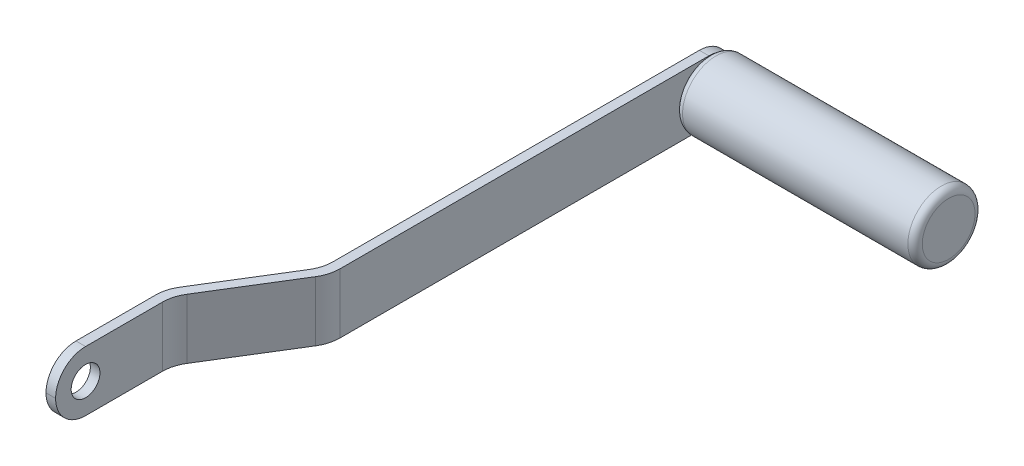
ISO-10303-21;
HEADER;
FILE_DESCRIPTION(('STEP AP214'),'2;1');
FILE_NAME('part.step','',(''),(''),'','','');
FILE_SCHEMA(('AUTOMOTIVE_DESIGN { 1 0 10303 214 1 1 1 1 }'));
ENDSEC;
DATA;
#1=APPLICATION_CONTEXT('core data for automotive mechanical design processes');
#2=APPLICATION_PROTOCOL_DEFINITION('international standard','automotive_design',2000,#1);
#3=PRODUCT_CONTEXT('',#1,'mechanical');
#4=PRODUCT('Part','Part','',(#3));
#5=PRODUCT_RELATED_PRODUCT_CATEGORY('part','',(#4));
#6=PRODUCT_DEFINITION_FORMATION('','',#4);
#7=PRODUCT_DEFINITION_CONTEXT('part definition',#1,'design');
#8=PRODUCT_DEFINITION('design','',#6,#7);
#9=PRODUCT_DEFINITION_SHAPE('','',#8);
#10=(LENGTH_UNIT() NAMED_UNIT(*) SI_UNIT(.MILLI.,.METRE.));
#11=(NAMED_UNIT(*) PLANE_ANGLE_UNIT() SI_UNIT($,.RADIAN.));
#12=(NAMED_UNIT(*) SI_UNIT($,.STERADIAN.) SOLID_ANGLE_UNIT());
#13=UNCERTAINTY_MEASURE_WITH_UNIT(LENGTH_MEASURE(1.E-05),#10,'distance_accuracy_value','');
#14=(GEOMETRIC_REPRESENTATION_CONTEXT(3) GLOBAL_UNCERTAINTY_ASSIGNED_CONTEXT((#13)) GLOBAL_UNIT_ASSIGNED_CONTEXT((#10,
#11,#12)) REPRESENTATION_CONTEXT('',''));
#15=CARTESIAN_POINT('',(0.,0.,0.));
#16=DIRECTION('',(0.,0.,1.));
#17=DIRECTION('',(1.,0.,0.));
#18=AXIS2_PLACEMENT_3D('',#15,#16,#17);
#19=CARTESIAN_POINT('',(129.,12.5,-247.5));
#20=DIRECTION('',(-1.,0.,0.));
#21=DIRECTION('',(0.,0.,1.));
#22=AXIS2_PLACEMENT_3D('',#19,#20,#21);
#23=CYLINDRICAL_SURFACE('',#22,14.);
#24=CARTESIAN_POINT('',(126.,12.5,-247.5));
#25=DIRECTION('',(1.,0.,0.));
#26=DIRECTION('',(0.,0.,-1.));
#27=AXIS2_PLACEMENT_3D('',#24,#25,#26);
#28=CIRCLE('',#27,14.);
#29=CARTESIAN_POINT('',(126.,12.5,-261.5));
#30=VERTEX_POINT('',#29);
#31=EDGE_CURVE('E48',#30,#30,#28,.F.);
#32=ORIENTED_EDGE('',*,*,#31,.T.);
#33=EDGE_LOOP('',(#32));
#34=FACE_BOUND('',#33,.T.);
#35=CARTESIAN_POINT('',(32.,12.5,-247.5));
#36=DIRECTION('',(1.,0.,0.));
#37=DIRECTION('',(0.,0.,-1.));
#38=AXIS2_PLACEMENT_3D('',#35,#36,#37);
#39=CIRCLE('',#38,14.);
#40=CARTESIAN_POINT('',(32.,12.5,-261.5));
#41=VERTEX_POINT('',#40);
#42=EDGE_CURVE('E52',#41,#41,#39,.T.);
#43=ORIENTED_EDGE('',*,*,#42,.T.);
#44=EDGE_LOOP('',(#43));
#45=FACE_BOUND('',#44,.T.);
#46=ADVANCED_FACE('F41',(#34,#45),#23,.T.);
#47=CARTESIAN_POINT('',(129.,12.5,-247.5));
#48=DIRECTION('',(1.,0.,0.));
#49=DIRECTION('',(0.,0.,-1.));
#50=AXIS2_PLACEMENT_3D('',#47,#48,#49);
#51=PLANE('',#50);
#52=CARTESIAN_POINT('',(129.,12.5,-247.5));
#53=DIRECTION('',(1.,0.,0.));
#54=DIRECTION('',(0.,0.,-1.));
#55=AXIS2_PLACEMENT_3D('',#52,#53,#54);
#56=CIRCLE('',#55,11.);
#57=CARTESIAN_POINT('',(129.,12.5,-258.5));
#58=VERTEX_POINT('',#57);
#59=EDGE_CURVE('E56',#58,#58,#56,.T.);
#60=ORIENTED_EDGE('',*,*,#59,.T.);
#61=EDGE_LOOP('',(#60));
#62=FACE_BOUND('',#61,.T.);
#63=ADVANCED_FACE('F62',(#62),#51,.T.);
#64=CARTESIAN_POINT('',(29.,12.5,-247.5));
#65=DIRECTION('',(1.,0.,0.));
#66=DIRECTION('',(0.,0.,-1.));
#67=AXIS2_PLACEMENT_3D('',#64,#65,#66);
#68=PLANE('',#67);
#69=CARTESIAN_POINT('',(29.,12.5,-247.5));
#70=DIRECTION('',(1.,0.,0.));
#71=DIRECTION('',(0.,0.,-1.));
#72=AXIS2_PLACEMENT_3D('',#69,#70,#71);
#73=CIRCLE('',#72,11.);
#74=CARTESIAN_POINT('',(29.,12.5,-258.5));
#75=VERTEX_POINT('',#74);
#76=EDGE_CURVE('E11',#75,#75,#73,.F.);
#77=ORIENTED_EDGE('',*,*,#76,.T.);
#78=EDGE_LOOP('',(#77));
#79=FACE_BOUND('',#78,.T.);
#80=ADVANCED_FACE('F66',(#79),#68,.F.);
#81=CARTESIAN_POINT('',(126.,12.5,-247.5));
#82=DIRECTION('',(1.,0.,0.));
#83=DIRECTION('',(0.,0.,-1.));
#84=AXIS2_PLACEMENT_3D('',#81,#82,#83);
#85=TOROIDAL_SURFACE('',#84,11.,3.);
#86=ORIENTED_EDGE('',*,*,#31,.F.);
#87=EDGE_LOOP('',(#86));
#88=FACE_BOUND('',#87,.T.);
#89=ORIENTED_EDGE('',*,*,#59,.F.);
#90=EDGE_LOOP('',(#89));
#91=FACE_BOUND('',#90,.T.);
#92=ADVANCED_FACE('F64',(#88,#91),#85,.T.);
#93=CARTESIAN_POINT('',(32.,12.5,-247.5));
#94=DIRECTION('',(1.,0.,0.));
#95=DIRECTION('',(0.,0.,-1.));
#96=AXIS2_PLACEMENT_3D('',#93,#94,#95);
#97=TOROIDAL_SURFACE('',#96,11.,3.);
#98=ORIENTED_EDGE('',*,*,#76,.F.);
#99=EDGE_LOOP('',(#98));
#100=FACE_BOUND('',#99,.T.);
#101=ORIENTED_EDGE('',*,*,#42,.F.);
#102=EDGE_LOOP('',(#101));
#103=FACE_BOUND('',#102,.T.);
#104=ADVANCED_FACE('F43',(#100,#103),#97,.T.);
#105=CLOSED_SHELL('',(#46,#63,#80,#92,#104));
#106=MANIFOLD_SOLID_BREP('B2',#105);
#107=CARTESIAN_POINT('',(29.,25.,-90.4991813264486));
#108=DIRECTION('',(-1.,0.,0.));
#109=DIRECTION('',(0.,0.,1.));
#110=AXIS2_PLACEMENT_3D('',#107,#108,#109);
#111=PLANE('',#110);
#112=DIRECTION('',(0.,0.,-1.));
#113=VECTOR('',#112,1.);
#114=CARTESIAN_POINT('',(29.,0.,-90.4991813264486));
#115=LINE('',#114,#113);
#116=CARTESIAN_POINT('',(29.,0.,-93.6208777470412));
#117=VERTEX_POINT('',#116);
#118=CARTESIAN_POINT('',(29.,0.,-247.5));
#119=VERTEX_POINT('',#118);
#120=EDGE_CURVE('E230',#117,#119,#115,.T.);
#121=ORIENTED_EDGE('',*,*,#120,.T.);
#122=CARTESIAN_POINT('',(29.,12.5,-247.5));
#123=DIRECTION('',(-1.,0.,0.));
#124=DIRECTION('',(0.,0.,1.));
#125=AXIS2_PLACEMENT_3D('',#122,#123,#124);
#126=CIRCLE('',#125,12.5);
#127=CARTESIAN_POINT('',(29.,12.5,-260.));
#128=VERTEX_POINT('',#127);
#129=EDGE_CURVE('E296',#119,#128,#126,.F.);
#130=ORIENTED_EDGE('',*,*,#129,.T.);
#131=CARTESIAN_POINT('',(29.,12.5,-247.5));
#132=DIRECTION('',(-1.,0.,0.));
#133=DIRECTION('',(0.,0.,1.));
#134=AXIS2_PLACEMENT_3D('',#131,#132,#133);
#135=CIRCLE('',#134,12.5);
#136=CARTESIAN_POINT('',(29.,25.,-247.5));
#137=VERTEX_POINT('',#136);
#138=EDGE_CURVE('E294',#128,#137,#135,.F.);
#139=ORIENTED_EDGE('',*,*,#138,.T.);
#140=DIRECTION('',(0.,0.,-1.));
#141=VECTOR('',#140,1.);
#142=CARTESIAN_POINT('',(29.,25.,-90.4991813264486));
#143=LINE('',#142,#141);
#144=CARTESIAN_POINT('',(29.,25.,-93.6208777470412));
#145=VERTEX_POINT('',#144);
#146=EDGE_CURVE('E232',#145,#137,#143,.T.);
#147=ORIENTED_EDGE('',*,*,#146,.F.);
#148=DIRECTION('',(0.,-1.,0.));
#149=VECTOR('',#148,1.);
#150=CARTESIAN_POINT('',(29.,25.,-93.6208777470412));
#151=LINE('',#150,#149);
#152=EDGE_CURVE('E218',#145,#117,#151,.T.);
#153=ORIENTED_EDGE('',*,*,#152,.T.);
#154=EDGE_LOOP('',(#121,#130,#139,#147,#153));
#155=FACE_BOUND('',#154,.T.);
#156=ADVANCED_FACE('F112',(#155),#111,.F.);
#157=CARTESIAN_POINT('',(25.,25.,-90.4991813264486));
#158=DIRECTION('',(-1.,0.,0.));
#159=DIRECTION('',(0.,0.,1.));
#160=AXIS2_PLACEMENT_3D('',#157,#158,#159);
#161=PLANE('',#160);
#162=CARTESIAN_POINT('',(25.,12.5,-247.5));
#163=DIRECTION('',(-1.,0.,0.));
#164=DIRECTION('',(0.,0.,1.));
#165=AXIS2_PLACEMENT_3D('',#162,#163,#164);
#166=CIRCLE('',#165,12.5);
#167=CARTESIAN_POINT('',(25.,25.,-247.5));
#168=VERTEX_POINT('',#167);
#169=CARTESIAN_POINT('',(25.,12.5,-260.));
#170=VERTEX_POINT('',#169);
#171=EDGE_CURVE('E298',#168,#170,#166,.T.);
#172=ORIENTED_EDGE('',*,*,#171,.T.);
#173=CARTESIAN_POINT('',(25.,12.5,-247.5));
#174=DIRECTION('',(-1.,0.,0.));
#175=DIRECTION('',(0.,0.,1.));
#176=AXIS2_PLACEMENT_3D('',#173,#174,#175);
#177=CIRCLE('',#176,12.5);
#178=CARTESIAN_POINT('',(25.,0.,-247.5));
#179=VERTEX_POINT('',#178);
#180=EDGE_CURVE('E300',#170,#179,#177,.T.);
#181=ORIENTED_EDGE('',*,*,#180,.T.);
#182=DIRECTION('',(0.,0.,-1.));
#183=VECTOR('',#182,1.);
#184=CARTESIAN_POINT('',(25.,0.,-90.4991813264486));
#185=LINE('',#184,#183);
#186=CARTESIAN_POINT('',(25.,0.,-94.7560400818022));
#187=VERTEX_POINT('',#186);
#188=EDGE_CURVE('E240',#187,#179,#185,.T.);
#189=ORIENTED_EDGE('',*,*,#188,.F.);
#190=DIRECTION('',(0.,-1.,0.));
#191=VECTOR('',#190,1.);
#192=CARTESIAN_POINT('',(25.,25.,-94.7560400818022));
#193=LINE('',#192,#191);
#194=CARTESIAN_POINT('',(25.,25.,-94.7560400818022));
#195=VERTEX_POINT('',#194);
#196=EDGE_CURVE('E273',#187,#195,#193,.F.);
#197=ORIENTED_EDGE('',*,*,#196,.T.);
#198=DIRECTION('',(0.,0.,-1.));
#199=VECTOR('',#198,1.);
#200=CARTESIAN_POINT('',(25.,25.,-90.4991813264486));
#201=LINE('',#200,#199);
#202=EDGE_CURVE('E322',#195,#168,#201,.T.);
#203=ORIENTED_EDGE('',*,*,#202,.T.);
#204=EDGE_LOOP('',(#172,#181,#189,#197,#203));
#205=FACE_BOUND('',#204,.T.);
#206=ADVANCED_FACE('F357',(#205),#161,.T.);
#207=CARTESIAN_POINT('',(0.,25.,-50.));
#208=DIRECTION('',(-0.850931364161853,0.,-0.525276892206052));
#209=DIRECTION('',(-0.525276892206052,0.,0.850931364161853));
#210=AXIS2_PLACEMENT_3D('',#207,#208,#209);
#211=PLANE('',#210);
#212=DIRECTION('',(0.525276892206052,0.,-0.850931364161853));
#213=VECTOR('',#212,1.);
#214=CARTESIAN_POINT('',(0.,25.,-50.));
#215=LINE('',#214,#213);
#216=CARTESIAN_POINT('',(2.23602953757221,25.,-53.6222946277373));
#217=VERTEX_POINT('',#216);
#218=CARTESIAN_POINT('',(22.7639704624278,25.,-86.8768866987114));
#219=VERTEX_POINT('',#218);
#220=EDGE_CURVE('E325',#217,#219,#215,.T.);
#221=ORIENTED_EDGE('',*,*,#220,.T.);
#222=DIRECTION('',(0.,-1.,0.));
#223=VECTOR('',#222,1.);
#224=CARTESIAN_POINT('',(22.7639704624278,0.,-86.8768866987114));
#225=LINE('',#224,#223);
#226=CARTESIAN_POINT('',(22.7639704624278,0.,-86.8768866987114));
#227=VERTEX_POINT('',#226);
#228=EDGE_CURVE('E270',#219,#227,#225,.T.);
#229=ORIENTED_EDGE('',*,*,#228,.T.);
#230=DIRECTION('',(0.525276892206052,0.,-0.850931364161853));
#231=VECTOR('',#230,1.);
#232=CARTESIAN_POINT('',(0.,0.,-50.));
#233=LINE('',#232,#231);
#234=CARTESIAN_POINT('',(2.23602953757221,0.,-53.6222946277373));
#235=VERTEX_POINT('',#234);
#236=EDGE_CURVE('E243',#235,#227,#233,.T.);
#237=ORIENTED_EDGE('',*,*,#236,.F.);
#238=DIRECTION('',(0.,-1.,0.));
#239=VECTOR('',#238,1.);
#240=CARTESIAN_POINT('',(2.23602953757221,25.,-53.6222946277373));
#241=LINE('',#240,#239);
#242=EDGE_CURVE('E268',#235,#217,#241,.F.);
#243=ORIENTED_EDGE('',*,*,#242,.T.);
#244=EDGE_LOOP('',(#221,#229,#237,#243));
#245=FACE_BOUND('',#244,.T.);
#246=ADVANCED_FACE('F353',(#245),#211,.T.);
#247=CARTESIAN_POINT('',(0.,25.,0.));
#248=DIRECTION('',(-1.,0.,0.));
#249=DIRECTION('',(0.,0.,1.));
#250=AXIS2_PLACEMENT_3D('',#247,#248,#249);
#251=PLANE('',#250);
#252=CARTESIAN_POINT('',(0.,12.5,-12.5));
#253=DIRECTION('',(-1.,0.,0.));
#254=DIRECTION('',(0.,0.,1.));
#255=AXIS2_PLACEMENT_3D('',#252,#253,#254);
#256=CIRCLE('',#255,6.);
#257=CARTESIAN_POINT('',(0.,12.5,-6.5));
#258=VERTEX_POINT('',#257);
#259=EDGE_CURVE('E313',#258,#258,#256,.T.);
#260=ORIENTED_EDGE('',*,*,#259,.F.);
#261=EDGE_LOOP('',(#260));
#262=FACE_BOUND('',#261,.T.);
#263=DIRECTION('',(0.,0.,-1.));
#264=VECTOR('',#263,1.);
#265=CARTESIAN_POINT('',(0.,0.,0.));
#266=LINE('',#265,#264);
#267=CARTESIAN_POINT('',(0.,0.,-12.5));
#268=VERTEX_POINT('',#267);
#269=CARTESIAN_POINT('',(0.,0.,-45.7431412446465));
#270=VERTEX_POINT('',#269);
#271=EDGE_CURVE('E253',#268,#270,#266,.T.);
#272=ORIENTED_EDGE('',*,*,#271,.F.);
#273=CARTESIAN_POINT('',(0.,12.5,-12.5));
#274=DIRECTION('',(-1.,0.,0.));
#275=DIRECTION('',(0.,0.,1.));
#276=AXIS2_PLACEMENT_3D('',#273,#274,#275);
#277=CIRCLE('',#276,12.5);
#278=CARTESIAN_POINT('',(0.,12.5,0.));
#279=VERTEX_POINT('',#278);
#280=EDGE_CURVE('E135',#268,#279,#277,.T.);
#281=ORIENTED_EDGE('',*,*,#280,.T.);
#282=CARTESIAN_POINT('',(0.,12.5,-12.5));
#283=DIRECTION('',(-1.,0.,0.));
#284=DIRECTION('',(0.,0.,1.));
#285=AXIS2_PLACEMENT_3D('',#282,#283,#284);
#286=CIRCLE('',#285,12.5);
#287=CARTESIAN_POINT('',(0.,25.,-12.5));
#288=VERTEX_POINT('',#287);
#289=EDGE_CURVE('E306',#279,#288,#286,.T.);
#290=ORIENTED_EDGE('',*,*,#289,.T.);
#291=DIRECTION('',(0.,0.,-1.));
#292=VECTOR('',#291,1.);
#293=CARTESIAN_POINT('',(0.,25.,0.));
#294=LINE('',#293,#292);
#295=CARTESIAN_POINT('',(0.,25.,-45.7431412446465));
#296=VERTEX_POINT('',#295);
#297=EDGE_CURVE('E328',#288,#296,#294,.T.);
#298=ORIENTED_EDGE('',*,*,#297,.T.);
#299=DIRECTION('',(0.,-1.,0.));
#300=VECTOR('',#299,1.);
#301=CARTESIAN_POINT('',(0.,25.,-45.7431412446465));
#302=LINE('',#301,#300);
#303=EDGE_CURVE('E275',#296,#270,#302,.T.);
#304=ORIENTED_EDGE('',*,*,#303,.T.);
#305=EDGE_LOOP('',(#272,#281,#290,#298,#304));
#306=FACE_BOUND('',#305,.T.);
#307=ADVANCED_FACE('F346',(#262,#306),#251,.T.);
#308=CARTESIAN_POINT('',(4.,25.,0.));
#309=DIRECTION('',(-1.,0.,0.));
#310=DIRECTION('',(0.,0.,1.));
#311=AXIS2_PLACEMENT_3D('',#308,#309,#310);
#312=PLANE('',#311);
#313=CARTESIAN_POINT('',(4.,12.5,-12.5));
#314=DIRECTION('',(-1.,0.,0.));
#315=DIRECTION('',(0.,0.,1.));
#316=AXIS2_PLACEMENT_3D('',#313,#314,#315);
#317=CIRCLE('',#316,6.);
#318=CARTESIAN_POINT('',(4.,12.5,-6.5));
#319=VERTEX_POINT('',#318);
#320=EDGE_CURVE('E116',#319,#319,#317,.T.);
#321=ORIENTED_EDGE('',*,*,#320,.T.);
#322=EDGE_LOOP('',(#321));
#323=FACE_BOUND('',#322,.T.);
#324=CARTESIAN_POINT('',(4.,12.5,-12.5));
#325=DIRECTION('',(-1.,0.,0.));
#326=DIRECTION('',(0.,0.,1.));
#327=AXIS2_PLACEMENT_3D('',#324,#325,#326);
#328=CIRCLE('',#327,12.5);
#329=CARTESIAN_POINT('',(4.,25.,-12.5));
#330=VERTEX_POINT('',#329);
#331=CARTESIAN_POINT('',(4.,12.5,0.));
#332=VERTEX_POINT('',#331);
#333=EDGE_CURVE('E121',#330,#332,#328,.F.);
#334=ORIENTED_EDGE('',*,*,#333,.T.);
#335=CARTESIAN_POINT('',(4.,12.5,-12.5));
#336=DIRECTION('',(-1.,0.,0.));
#337=DIRECTION('',(0.,0.,1.));
#338=AXIS2_PLACEMENT_3D('',#335,#336,#337);
#339=CIRCLE('',#338,12.5);
#340=CARTESIAN_POINT('',(4.,0.,-12.5));
#341=VERTEX_POINT('',#340);
#342=EDGE_CURVE('E39',#332,#341,#339,.F.);
#343=ORIENTED_EDGE('',*,*,#342,.T.);
#344=DIRECTION('',(0.,0.,-1.));
#345=VECTOR('',#344,1.);
#346=CARTESIAN_POINT('',(4.,0.,0.));
#347=LINE('',#346,#345);
#348=CARTESIAN_POINT('',(4.,0.,-44.6079789098856));
#349=VERTEX_POINT('',#348);
#350=EDGE_CURVE('E255',#341,#349,#347,.T.);
#351=ORIENTED_EDGE('',*,*,#350,.T.);
#352=DIRECTION('',(0.,-1.,0.));
#353=VECTOR('',#352,1.);
#354=CARTESIAN_POINT('',(4.,25.,-44.6079789098856));
#355=LINE('',#354,#353);
#356=CARTESIAN_POINT('',(4.,25.,-44.6079789098856));
#357=VERTEX_POINT('',#356);
#358=EDGE_CURVE('E278',#349,#357,#355,.F.);
#359=ORIENTED_EDGE('',*,*,#358,.T.);
#360=DIRECTION('',(0.,0.,-1.));
#361=VECTOR('',#360,1.);
#362=CARTESIAN_POINT('',(4.,25.,0.));
#363=LINE('',#362,#361);
#364=EDGE_CURVE('E329',#330,#357,#363,.T.);
#365=ORIENTED_EDGE('',*,*,#364,.F.);
#366=EDGE_LOOP('',(#334,#343,#351,#359,#365));
#367=FACE_BOUND('',#366,.T.);
#368=ADVANCED_FACE('F344',(#323,#367),#312,.F.);
#369=CARTESIAN_POINT('',(3.40372545664741,25.,-47.8988924311758));
#370=DIRECTION('',(-0.850931364161853,0.,-0.525276892206052));
#371=DIRECTION('',(-0.525276892206052,0.,0.850931364161853));
#372=AXIS2_PLACEMENT_3D('',#369,#370,#371);
#373=PLANE('',#372);
#374=DIRECTION('',(0.525276892206052,0.,-0.850931364161853));
#375=VECTOR('',#374,1.);
#376=CARTESIAN_POINT('',(3.40372545664741,0.,-47.8988924311758));
#377=LINE('',#376,#375);
#378=CARTESIAN_POINT('',(6.23602953757221,0.,-52.4871322929763));
#379=VERTEX_POINT('',#378);
#380=CARTESIAN_POINT('',(26.7639704624278,0.,-85.7417243639504));
#381=VERTEX_POINT('',#380);
#382=EDGE_CURVE('E257',#379,#381,#377,.T.);
#383=ORIENTED_EDGE('',*,*,#382,.T.);
#384=DIRECTION('',(0.,-1.,0.));
#385=VECTOR('',#384,1.);
#386=CARTESIAN_POINT('',(26.7639704624278,25.,-85.7417243639504));
#387=LINE('',#386,#385);
#388=CARTESIAN_POINT('',(26.7639704624278,25.,-85.7417243639504));
#389=VERTEX_POINT('',#388);
#390=EDGE_CURVE('E219',#381,#389,#387,.F.);
#391=ORIENTED_EDGE('',*,*,#390,.T.);
#392=DIRECTION('',(0.525276892206052,0.,-0.850931364161853));
#393=VECTOR('',#392,1.);
#394=CARTESIAN_POINT('',(3.40372545664741,25.,-47.8988924311758));
#395=LINE('',#394,#393);
#396=CARTESIAN_POINT('',(6.23602953757221,25.,-52.4871322929763));
#397=VERTEX_POINT('',#396);
#398=EDGE_CURVE('E233',#397,#389,#395,.T.);
#399=ORIENTED_EDGE('',*,*,#398,.F.);
#400=DIRECTION('',(0.,-1.,0.));
#401=VECTOR('',#400,1.);
#402=CARTESIAN_POINT('',(6.23602953757221,0.,-52.4871322929763));
#403=LINE('',#402,#401);
#404=EDGE_CURVE('E224',#397,#379,#403,.T.);
#405=ORIENTED_EDGE('',*,*,#404,.T.);
#406=EDGE_LOOP('',(#383,#391,#399,#405));
#407=FACE_BOUND('',#406,.T.);
#408=ADVANCED_FACE('F337',(#407),#373,.F.);
#409=CARTESIAN_POINT('',(0.,25.,0.));
#410=DIRECTION('',(0.,-1.,0.));
#411=DIRECTION('',(-1.,0.,0.));
#412=AXIS2_PLACEMENT_3D('',#409,#410,#411);
#413=PLANE('',#412);
#414=ORIENTED_EDGE('',*,*,#146,.T.);
#415=DIRECTION('',(1.,0.,0.));
#416=VECTOR('',#415,1.);
#417=CARTESIAN_POINT('',(25.,25.,-247.5));
#418=LINE('',#417,#416);
#419=EDGE_CURVE('E304',#137,#168,#418,.F.);
#420=ORIENTED_EDGE('',*,*,#419,.T.);
#421=ORIENTED_EDGE('',*,*,#202,.F.);
#422=CARTESIAN_POINT('',(10.,25.,-94.7560400818022));
#423=DIRECTION('',(0.,-1.,0.));
#424=DIRECTION('',(0.,0.,-1.));
#425=AXIS2_PLACEMENT_3D('',#422,#423,#424);
#426=CIRCLE('',#425,15.);
#427=EDGE_CURVE('E283',#195,#219,#426,.T.);
#428=ORIENTED_EDGE('',*,*,#427,.T.);
#429=ORIENTED_EDGE('',*,*,#220,.F.);
#430=CARTESIAN_POINT('',(15.,25.,-45.7431412446465));
#431=DIRECTION('',(0.,-1.,0.));
#432=DIRECTION('',(0.,0.,-1.));
#433=AXIS2_PLACEMENT_3D('',#430,#431,#432);
#434=CIRCLE('',#433,15.);
#435=EDGE_CURVE('E263',#217,#296,#434,.F.);
#436=ORIENTED_EDGE('',*,*,#435,.T.);
#437=ORIENTED_EDGE('',*,*,#297,.F.);
#438=DIRECTION('',(-1.,0.,0.));
#439=VECTOR('',#438,1.);
#440=CARTESIAN_POINT('',(4.,25.,-12.5));
#441=LINE('',#440,#439);
#442=EDGE_CURVE('E302',#288,#330,#441,.F.);
#443=ORIENTED_EDGE('',*,*,#442,.T.);
#444=ORIENTED_EDGE('',*,*,#364,.T.);
#445=CARTESIAN_POINT('',(19.,25.,-44.6079789098856));
#446=DIRECTION('',(0.,-1.,0.));
#447=DIRECTION('',(0.,0.,-1.));
#448=AXIS2_PLACEMENT_3D('',#445,#446,#447);
#449=CIRCLE('',#448,15.);
#450=EDGE_CURVE('E288',#357,#397,#449,.T.);
#451=ORIENTED_EDGE('',*,*,#450,.T.);
#452=ORIENTED_EDGE('',*,*,#398,.T.);
#453=CARTESIAN_POINT('',(14.,25.,-93.6208777470412));
#454=DIRECTION('',(0.,-1.,0.));
#455=DIRECTION('',(0.,0.,-1.));
#456=AXIS2_PLACEMENT_3D('',#453,#454,#455);
#457=CIRCLE('',#456,15.);
#458=EDGE_CURVE('E266',#389,#145,#457,.F.);
#459=ORIENTED_EDGE('',*,*,#458,.T.);
#460=EDGE_LOOP('',(#414,#420,#421,#428,#429,#436,#437,#443,#444,#451,#452,#459));
#461=FACE_BOUND('',#460,.T.);
#462=ADVANCED_FACE('F333',(#461),#413,.F.);
#463=CARTESIAN_POINT('',(0.,0.,0.));
#464=DIRECTION('',(0.,-1.,0.));
#465=DIRECTION('',(-1.,0.,0.));
#466=AXIS2_PLACEMENT_3D('',#463,#464,#465);
#467=PLANE('',#466);
#468=ORIENTED_EDGE('',*,*,#188,.T.);
#469=DIRECTION('',(1.,0.,0.));
#470=VECTOR('',#469,1.);
#471=CARTESIAN_POINT('',(0.,0.,-247.5));
#472=LINE('',#471,#470);
#473=EDGE_CURVE('E239',#179,#119,#472,.T.);
#474=ORIENTED_EDGE('',*,*,#473,.T.);
#475=ORIENTED_EDGE('',*,*,#120,.F.);
#476=CARTESIAN_POINT('',(14.,0.,-93.6208777470412));
#477=DIRECTION('',(0.,-1.,0.));
#478=DIRECTION('',(0.,0.,-1.));
#479=AXIS2_PLACEMENT_3D('',#476,#477,#478);
#480=CIRCLE('',#479,15.);
#481=EDGE_CURVE('E214',#117,#381,#480,.T.);
#482=ORIENTED_EDGE('',*,*,#481,.T.);
#483=ORIENTED_EDGE('',*,*,#382,.F.);
#484=CARTESIAN_POINT('',(19.,0.,-44.6079789098856));
#485=DIRECTION('',(0.,-1.,0.));
#486=DIRECTION('',(0.,0.,-1.));
#487=AXIS2_PLACEMENT_3D('',#484,#485,#486);
#488=CIRCLE('',#487,15.);
#489=EDGE_CURVE('E285',#379,#349,#488,.F.);
#490=ORIENTED_EDGE('',*,*,#489,.T.);
#491=ORIENTED_EDGE('',*,*,#350,.F.);
#492=DIRECTION('',(-1.,0.,0.));
#493=VECTOR('',#492,1.);
#494=CARTESIAN_POINT('',(0.,0.,-12.5));
#495=LINE('',#494,#493);
#496=EDGE_CURVE('E290',#341,#268,#495,.T.);
#497=ORIENTED_EDGE('',*,*,#496,.T.);
#498=ORIENTED_EDGE('',*,*,#271,.T.);
#499=CARTESIAN_POINT('',(15.,0.,-45.7431412446465));
#500=DIRECTION('',(0.,-1.,0.));
#501=DIRECTION('',(0.,0.,-1.));
#502=AXIS2_PLACEMENT_3D('',#499,#500,#501);
#503=CIRCLE('',#502,15.);
#504=EDGE_CURVE('E225',#270,#235,#503,.T.);
#505=ORIENTED_EDGE('',*,*,#504,.T.);
#506=ORIENTED_EDGE('',*,*,#236,.T.);
#507=CARTESIAN_POINT('',(10.,0.,-94.7560400818022));
#508=DIRECTION('',(0.,-1.,0.));
#509=DIRECTION('',(0.,0.,-1.));
#510=AXIS2_PLACEMENT_3D('',#507,#508,#509);
#511=CIRCLE('',#510,15.);
#512=EDGE_CURVE('E281',#227,#187,#511,.F.);
#513=ORIENTED_EDGE('',*,*,#512,.T.);
#514=EDGE_LOOP('',(#468,#474,#475,#482,#483,#490,#491,#497,#498,#505,#506,#513));
#515=FACE_BOUND('',#514,.T.);
#516=ADVANCED_FACE('F237',(#515),#467,.T.);
#517=CARTESIAN_POINT('',(14.,25.,-93.6208777470412));
#518=DIRECTION('',(0.,-1.,0.));
#519=DIRECTION('',(0.,0.,-1.));
#520=AXIS2_PLACEMENT_3D('',#517,#518,#519);
#521=CYLINDRICAL_SURFACE('',#520,15.);
#522=ORIENTED_EDGE('',*,*,#458,.F.);
#523=ORIENTED_EDGE('',*,*,#390,.F.);
#524=ORIENTED_EDGE('',*,*,#481,.F.);
#525=ORIENTED_EDGE('',*,*,#152,.F.);
#526=EDGE_LOOP('',(#522,#523,#524,#525));
#527=FACE_BOUND('',#526,.T.);
#528=ADVANCED_FACE('F217',(#527),#521,.T.);
#529=CARTESIAN_POINT('',(10.,25.,-94.7560400818022));
#530=DIRECTION('',(0.,1.,0.));
#531=DIRECTION('',(0.,0.,1.));
#532=AXIS2_PLACEMENT_3D('',#529,#530,#531);
#533=CYLINDRICAL_SURFACE('',#532,15.);
#534=ORIENTED_EDGE('',*,*,#427,.F.);
#535=ORIENTED_EDGE('',*,*,#196,.F.);
#536=ORIENTED_EDGE('',*,*,#512,.F.);
#537=ORIENTED_EDGE('',*,*,#228,.F.);
#538=EDGE_LOOP('',(#534,#535,#536,#537));
#539=FACE_BOUND('',#538,.T.);
#540=ADVANCED_FACE('F368',(#539),#533,.F.);
#541=CARTESIAN_POINT('',(15.,25.,-45.7431412446465));
#542=DIRECTION('',(0.,-1.,0.));
#543=DIRECTION('',(0.,0.,-1.));
#544=AXIS2_PLACEMENT_3D('',#541,#542,#543);
#545=CYLINDRICAL_SURFACE('',#544,15.);
#546=ORIENTED_EDGE('',*,*,#435,.F.);
#547=ORIENTED_EDGE('',*,*,#242,.F.);
#548=ORIENTED_EDGE('',*,*,#504,.F.);
#549=ORIENTED_EDGE('',*,*,#303,.F.);
#550=EDGE_LOOP('',(#546,#547,#548,#549));
#551=FACE_BOUND('',#550,.T.);
#552=ADVANCED_FACE('F371',(#551),#545,.T.);
#553=CARTESIAN_POINT('',(19.,25.,-44.6079789098856));
#554=DIRECTION('',(0.,1.,0.));
#555=DIRECTION('',(0.,0.,1.));
#556=AXIS2_PLACEMENT_3D('',#553,#554,#555);
#557=CYLINDRICAL_SURFACE('',#556,15.);
#558=ORIENTED_EDGE('',*,*,#450,.F.);
#559=ORIENTED_EDGE('',*,*,#358,.F.);
#560=ORIENTED_EDGE('',*,*,#489,.F.);
#561=ORIENTED_EDGE('',*,*,#404,.F.);
#562=EDGE_LOOP('',(#558,#559,#560,#561));
#563=FACE_BOUND('',#562,.T.);
#564=ADVANCED_FACE('F339',(#563),#557,.F.);
#565=CARTESIAN_POINT('',(25.,12.5,-247.5));
#566=DIRECTION('',(-1.,0.,0.));
#567=DIRECTION('',(0.,0.,1.));
#568=AXIS2_PLACEMENT_3D('',#565,#566,#567);
#569=CYLINDRICAL_SURFACE('',#568,12.5);
#570=DIRECTION('',(1.,0.,0.));
#571=VECTOR('',#570,1.);
#572=CARTESIAN_POINT('',(29.,12.5,-260.));
#573=LINE('',#572,#571);
#574=EDGE_CURVE('E241',#170,#128,#573,.T.);
#575=ORIENTED_EDGE('',*,*,#574,.F.);
#576=ORIENTED_EDGE('',*,*,#171,.F.);
#577=ORIENTED_EDGE('',*,*,#419,.F.);
#578=ORIENTED_EDGE('',*,*,#138,.F.);
#579=EDGE_LOOP('',(#575,#576,#577,#578));
#580=FACE_BOUND('',#579,.T.);
#581=ADVANCED_FACE('F378',(#580),#569,.T.);
#582=CARTESIAN_POINT('',(0.,12.5,-247.5));
#583=DIRECTION('',(1.,0.,0.));
#584=DIRECTION('',(0.,0.,-1.));
#585=AXIS2_PLACEMENT_3D('',#582,#583,#584);
#586=CYLINDRICAL_SURFACE('',#585,12.5);
#587=ORIENTED_EDGE('',*,*,#180,.F.);
#588=ORIENTED_EDGE('',*,*,#574,.T.);
#589=ORIENTED_EDGE('',*,*,#129,.F.);
#590=ORIENTED_EDGE('',*,*,#473,.F.);
#591=EDGE_LOOP('',(#587,#588,#589,#590));
#592=FACE_BOUND('',#591,.T.);
#593=ADVANCED_FACE('F379',(#592),#586,.T.);
#594=CARTESIAN_POINT('',(4.,12.5,-12.5));
#595=DIRECTION('',(1.,0.,0.));
#596=DIRECTION('',(0.,0.,-1.));
#597=AXIS2_PLACEMENT_3D('',#594,#595,#596);
#598=CYLINDRICAL_SURFACE('',#597,12.5);
#599=DIRECTION('',(-1.,0.,0.));
#600=VECTOR('',#599,1.);
#601=CARTESIAN_POINT('',(0.,12.5,0.));
#602=LINE('',#601,#600);
#603=EDGE_CURVE('E246',#332,#279,#602,.T.);
#604=ORIENTED_EDGE('',*,*,#603,.F.);
#605=ORIENTED_EDGE('',*,*,#333,.F.);
#606=ORIENTED_EDGE('',*,*,#442,.F.);
#607=ORIENTED_EDGE('',*,*,#289,.F.);
#608=EDGE_LOOP('',(#604,#605,#606,#607));
#609=FACE_BOUND('',#608,.T.);
#610=ADVANCED_FACE('F114',(#609),#598,.T.);
#611=CARTESIAN_POINT('',(0.,12.5,-12.5));
#612=DIRECTION('',(-1.,0.,0.));
#613=DIRECTION('',(0.,0.,1.));
#614=AXIS2_PLACEMENT_3D('',#611,#612,#613);
#615=CYLINDRICAL_SURFACE('',#614,12.5);
#616=ORIENTED_EDGE('',*,*,#342,.F.);
#617=ORIENTED_EDGE('',*,*,#603,.T.);
#618=ORIENTED_EDGE('',*,*,#280,.F.);
#619=ORIENTED_EDGE('',*,*,#496,.F.);
#620=EDGE_LOOP('',(#616,#617,#618,#619));
#621=FACE_BOUND('',#620,.T.);
#622=ADVANCED_FACE('F343',(#621),#615,.T.);
#623=CARTESIAN_POINT('',(10.,12.5,-12.5));
#624=DIRECTION('',(-1.,0.,0.));
#625=DIRECTION('',(0.,0.,1.));
#626=AXIS2_PLACEMENT_3D('',#623,#624,#625);
#627=CYLINDRICAL_SURFACE('',#626,6.);
#628=ORIENTED_EDGE('',*,*,#259,.T.);
#629=EDGE_LOOP('',(#628));
#630=FACE_BOUND('',#629,.T.);
#631=ORIENTED_EDGE('',*,*,#320,.F.);
#632=EDGE_LOOP('',(#631));
#633=FACE_BOUND('',#632,.T.);
#634=ADVANCED_FACE('F386',(#630,#633),#627,.F.);
#635=CLOSED_SHELL('',(#156,#206,#246,#307,#368,#408,#462,#516,#528,#540,#552,#564,#581,#593,
#610,#622,#634));
#636=MANIFOLD_SOLID_BREP('B6',#635);
#637=ADVANCED_BREP_SHAPE_REPRESENTATION('',(#18,#106,#636),#14);
#638=SHAPE_DEFINITION_REPRESENTATION(#9,#637);
ENDSEC;
END-ISO-10303-21;
